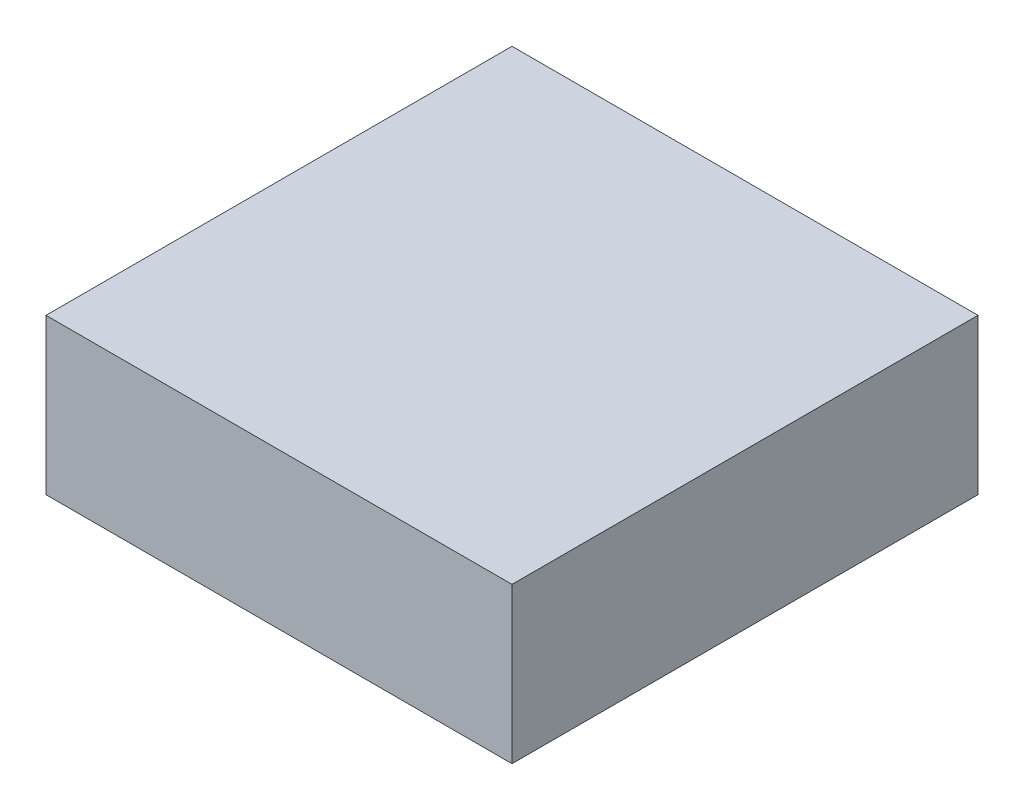
ISO-10303-21;
HEADER;
FILE_DESCRIPTION(('STEP AP214'),'2;1');
FILE_NAME('part.step','',(''),(''),'','','');
FILE_SCHEMA(('AUTOMOTIVE_DESIGN { 1 0 10303 214 1 1 1 1 }'));
ENDSEC;
DATA;
#1=APPLICATION_CONTEXT('core data for automotive mechanical design processes');
#2=APPLICATION_PROTOCOL_DEFINITION('international standard','automotive_design',2000,#1);
#3=PRODUCT_CONTEXT('',#1,'mechanical');
#4=PRODUCT('Part','Part','',(#3));
#5=PRODUCT_RELATED_PRODUCT_CATEGORY('part','',(#4));
#6=PRODUCT_DEFINITION_FORMATION('','',#4);
#7=PRODUCT_DEFINITION_CONTEXT('part definition',#1,'design');
#8=PRODUCT_DEFINITION('design','',#6,#7);
#9=PRODUCT_DEFINITION_SHAPE('','',#8);
#10=(LENGTH_UNIT() NAMED_UNIT(*) SI_UNIT(.MILLI.,.METRE.));
#11=(NAMED_UNIT(*) PLANE_ANGLE_UNIT() SI_UNIT($,.RADIAN.));
#12=(NAMED_UNIT(*) SI_UNIT($,.STERADIAN.) SOLID_ANGLE_UNIT());
#13=UNCERTAINTY_MEASURE_WITH_UNIT(LENGTH_MEASURE(1.E-05),#10,'distance_accuracy_value','');
#14=(GEOMETRIC_REPRESENTATION_CONTEXT(3) GLOBAL_UNCERTAINTY_ASSIGNED_CONTEXT((#13)) GLOBAL_UNIT_ASSIGNED_CONTEXT((#10,
#11,#12)) REPRESENTATION_CONTEXT('',''));
#15=CARTESIAN_POINT('',(0.,0.,0.));
#16=DIRECTION('',(0.,0.,1.));
#17=DIRECTION('',(1.,0.,0.));
#18=AXIS2_PLACEMENT_3D('',#15,#16,#17);
#19=CARTESIAN_POINT('',(0.,1.,0.));
#20=DIRECTION('',(1.,0.,0.));
#21=DIRECTION('',(0.,0.,-1.));
#22=AXIS2_PLACEMENT_3D('',#19,#20,#21);
#23=PLANE('',#22);
#24=DIRECTION('',(0.,0.,1.));
#25=VECTOR('',#24,1.);
#26=CARTESIAN_POINT('',(0.,0.,0.));
#27=LINE('',#26,#25);
#28=CARTESIAN_POINT('',(0.,0.,0.));
#29=VERTEX_POINT('',#28);
#30=CARTESIAN_POINT('',(0.,0.,3.));
#31=VERTEX_POINT('',#30);
#32=EDGE_CURVE('E107',#29,#31,#27,.T.);
#33=ORIENTED_EDGE('',*,*,#32,.T.);
#34=DIRECTION('',(0.,-1.,0.));
#35=VECTOR('',#34,1.);
#36=CARTESIAN_POINT('',(0.,1.,3.));
#37=LINE('',#36,#35);
#38=CARTESIAN_POINT('',(0.,1.,3.));
#39=VERTEX_POINT('',#38);
#40=EDGE_CURVE('E11',#39,#31,#37,.T.);
#41=ORIENTED_EDGE('',*,*,#40,.F.);
#42=DIRECTION('',(0.,0.,1.));
#43=VECTOR('',#42,1.);
#44=CARTESIAN_POINT('',(0.,1.,0.));
#45=LINE('',#44,#43);
#46=CARTESIAN_POINT('',(0.,1.,0.));
#47=VERTEX_POINT('',#46);
#48=EDGE_CURVE('E91',#47,#39,#45,.T.);
#49=ORIENTED_EDGE('',*,*,#48,.F.);
#50=DIRECTION('',(0.,-1.,0.));
#51=VECTOR('',#50,1.);
#52=CARTESIAN_POINT('',(0.,1.,0.));
#53=LINE('',#52,#51);
#54=EDGE_CURVE('E103',#47,#29,#53,.T.);
#55=ORIENTED_EDGE('',*,*,#54,.T.);
#56=EDGE_LOOP('',(#33,#41,#49,#55));
#57=FACE_BOUND('',#56,.T.);
#58=ADVANCED_FACE('F39',(#57),#23,.F.);
#59=CARTESIAN_POINT('',(0.,1.,3.));
#60=DIRECTION('',(0.,0.,-1.));
#61=DIRECTION('',(-1.,0.,0.));
#62=AXIS2_PLACEMENT_3D('',#59,#60,#61);
#63=PLANE('',#62);
#64=DIRECTION('',(1.,0.,0.));
#65=VECTOR('',#64,1.);
#66=CARTESIAN_POINT('',(0.,0.,3.));
#67=LINE('',#66,#65);
#68=CARTESIAN_POINT('',(3.,0.,3.));
#69=VERTEX_POINT('',#68);
#70=EDGE_CURVE('E96',#31,#69,#67,.T.);
#71=ORIENTED_EDGE('',*,*,#70,.T.);
#72=DIRECTION('',(0.,-1.,0.));
#73=VECTOR('',#72,1.);
#74=CARTESIAN_POINT('',(3.,1.,3.));
#75=LINE('',#74,#73);
#76=CARTESIAN_POINT('',(3.,1.,3.));
#77=VERTEX_POINT('',#76);
#78=EDGE_CURVE('E48',#77,#69,#75,.T.);
#79=ORIENTED_EDGE('',*,*,#78,.F.);
#80=DIRECTION('',(1.,0.,0.));
#81=VECTOR('',#80,1.);
#82=CARTESIAN_POINT('',(0.,1.,3.));
#83=LINE('',#82,#81);
#84=EDGE_CURVE('E86',#39,#77,#83,.T.);
#85=ORIENTED_EDGE('',*,*,#84,.F.);
#86=ORIENTED_EDGE('',*,*,#40,.T.);
#87=EDGE_LOOP('',(#71,#79,#85,#86));
#88=FACE_BOUND('',#87,.T.);
#89=ADVANCED_FACE('F95',(#88),#63,.F.);
#90=CARTESIAN_POINT('',(3.,1.,0.));
#91=DIRECTION('',(-1.,0.,0.));
#92=DIRECTION('',(0.,0.,1.));
#93=AXIS2_PLACEMENT_3D('',#90,#91,#92);
#94=PLANE('',#93);
#95=DIRECTION('',(0.,0.,-1.));
#96=VECTOR('',#95,1.);
#97=CARTESIAN_POINT('',(3.,0.,0.));
#98=LINE('',#97,#96);
#99=CARTESIAN_POINT('',(3.,0.,0.));
#100=VERTEX_POINT('',#99);
#101=EDGE_CURVE('E73',#69,#100,#98,.T.);
#102=ORIENTED_EDGE('',*,*,#101,.T.);
#103=DIRECTION('',(0.,-1.,0.));
#104=VECTOR('',#103,1.);
#105=CARTESIAN_POINT('',(3.,1.,0.));
#106=LINE('',#105,#104);
#107=CARTESIAN_POINT('',(3.,1.,0.));
#108=VERTEX_POINT('',#107);
#109=EDGE_CURVE('E98',#108,#100,#106,.T.);
#110=ORIENTED_EDGE('',*,*,#109,.F.);
#111=DIRECTION('',(0.,0.,-1.));
#112=VECTOR('',#111,1.);
#113=CARTESIAN_POINT('',(3.,1.,0.));
#114=LINE('',#113,#112);
#115=EDGE_CURVE('E89',#77,#108,#114,.T.);
#116=ORIENTED_EDGE('',*,*,#115,.F.);
#117=ORIENTED_EDGE('',*,*,#78,.T.);
#118=EDGE_LOOP('',(#102,#110,#116,#117));
#119=FACE_BOUND('',#118,.T.);
#120=ADVANCED_FACE('F99',(#119),#94,.F.);
#121=CARTESIAN_POINT('',(0.,1.,0.));
#122=DIRECTION('',(0.,0.,1.));
#123=DIRECTION('',(1.,0.,0.));
#124=AXIS2_PLACEMENT_3D('',#121,#122,#123);
#125=PLANE('',#124);
#126=DIRECTION('',(-1.,0.,0.));
#127=VECTOR('',#126,1.);
#128=CARTESIAN_POINT('',(0.,0.,0.));
#129=LINE('',#128,#127);
#130=EDGE_CURVE('E79',#100,#29,#129,.T.);
#131=ORIENTED_EDGE('',*,*,#130,.T.);
#132=ORIENTED_EDGE('',*,*,#54,.F.);
#133=DIRECTION('',(-1.,0.,0.));
#134=VECTOR('',#133,1.);
#135=CARTESIAN_POINT('',(0.,1.,0.));
#136=LINE('',#135,#134);
#137=EDGE_CURVE('E56',#108,#47,#136,.T.);
#138=ORIENTED_EDGE('',*,*,#137,.F.);
#139=ORIENTED_EDGE('',*,*,#109,.T.);
#140=EDGE_LOOP('',(#131,#132,#138,#139));
#141=FACE_BOUND('',#140,.T.);
#142=ADVANCED_FACE('F120',(#141),#125,.F.);
#143=CARTESIAN_POINT('',(0.,1.,0.));
#144=DIRECTION('',(0.,1.,0.));
#145=DIRECTION('',(0.,0.,1.));
#146=AXIS2_PLACEMENT_3D('',#143,#144,#145);
#147=PLANE('',#146);
#148=ORIENTED_EDGE('',*,*,#48,.T.);
#149=ORIENTED_EDGE('',*,*,#84,.T.);
#150=ORIENTED_EDGE('',*,*,#115,.T.);
#151=ORIENTED_EDGE('',*,*,#137,.T.);
#152=EDGE_LOOP('',(#148,#149,#150,#151));
#153=FACE_BOUND('',#152,.T.);
#154=ADVANCED_FACE('F87',(#153),#147,.T.);
#155=CARTESIAN_POINT('',(0.,0.,0.));
#156=DIRECTION('',(0.,1.,0.));
#157=DIRECTION('',(0.,0.,1.));
#158=AXIS2_PLACEMENT_3D('',#155,#156,#157);
#159=PLANE('',#158);
#160=ORIENTED_EDGE('',*,*,#32,.F.);
#161=ORIENTED_EDGE('',*,*,#130,.F.);
#162=ORIENTED_EDGE('',*,*,#101,.F.);
#163=ORIENTED_EDGE('',*,*,#70,.F.);
#164=EDGE_LOOP('',(#160,#161,#162,#163));
#165=FACE_BOUND('',#164,.T.);
#166=ADVANCED_FACE('F123',(#165),#159,.F.);
#167=CLOSED_SHELL('',(#58,#89,#120,#142,#154,#166));
#168=MANIFOLD_SOLID_BREP('B2',#167);
#169=ADVANCED_BREP_SHAPE_REPRESENTATION('',(#18,#168),#14);
#170=SHAPE_DEFINITION_REPRESENTATION(#9,#169);
ENDSEC;
END-ISO-10303-21;
